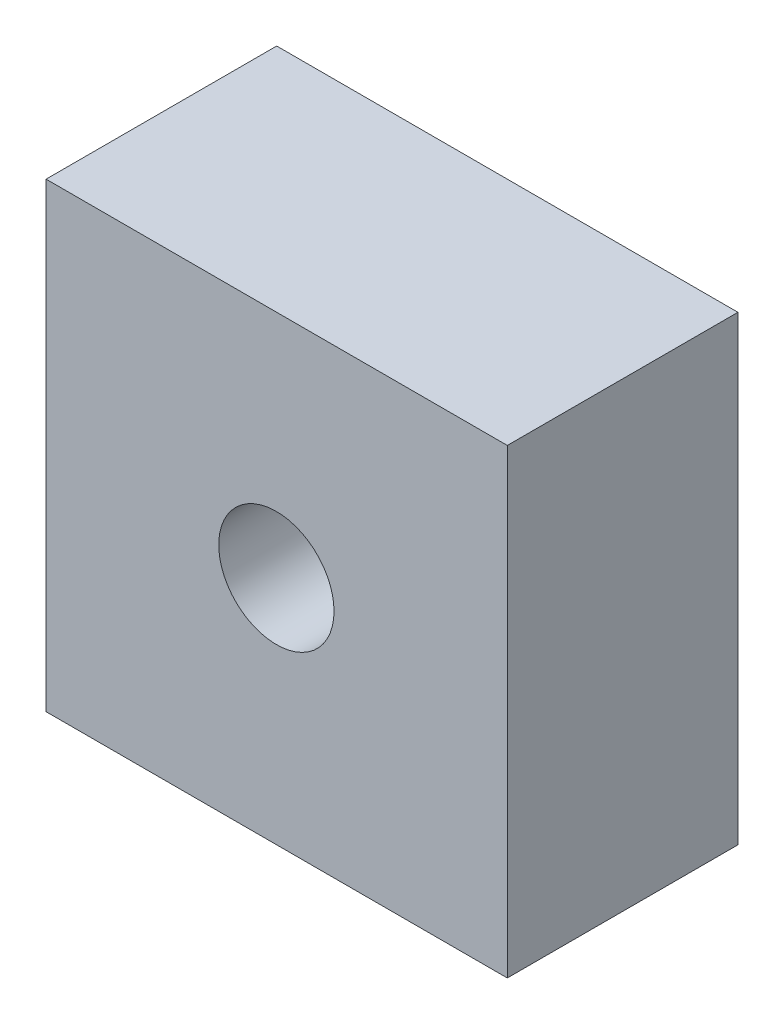
ISO-10303-21;
HEADER;
FILE_DESCRIPTION(('STEP AP214'),'2;1');
FILE_NAME('part.step','',(''),(''),'','','');
FILE_SCHEMA(('AUTOMOTIVE_DESIGN { 1 0 10303 214 1 1 1 1 }'));
ENDSEC;
DATA;
#1=APPLICATION_CONTEXT('core data for automotive mechanical design processes');
#2=APPLICATION_PROTOCOL_DEFINITION('international standard','automotive_design',2000,#1);
#3=PRODUCT_CONTEXT('',#1,'mechanical');
#4=PRODUCT('Part','Part','',(#3));
#5=PRODUCT_RELATED_PRODUCT_CATEGORY('part','',(#4));
#6=PRODUCT_DEFINITION_FORMATION('','',#4);
#7=PRODUCT_DEFINITION_CONTEXT('part definition',#1,'design');
#8=PRODUCT_DEFINITION('design','',#6,#7);
#9=PRODUCT_DEFINITION_SHAPE('','',#8);
#10=(LENGTH_UNIT() NAMED_UNIT(*) SI_UNIT(.MILLI.,.METRE.));
#11=(NAMED_UNIT(*) PLANE_ANGLE_UNIT() SI_UNIT($,.RADIAN.));
#12=(NAMED_UNIT(*) SI_UNIT($,.STERADIAN.) SOLID_ANGLE_UNIT());
#13=UNCERTAINTY_MEASURE_WITH_UNIT(LENGTH_MEASURE(1.E-05),#10,'distance_accuracy_value','');
#14=(GEOMETRIC_REPRESENTATION_CONTEXT(3) GLOBAL_UNCERTAINTY_ASSIGNED_CONTEXT((#13)) GLOBAL_UNIT_ASSIGNED_CONTEXT((#10,
#11,#12)) REPRESENTATION_CONTEXT('',''));
#15=CARTESIAN_POINT('',(0.,0.,0.));
#16=DIRECTION('',(0.,0.,1.));
#17=DIRECTION('',(1.,0.,0.));
#18=AXIS2_PLACEMENT_3D('',#15,#16,#17);
#19=CARTESIAN_POINT('',(0.,0.,10.));
#20=DIRECTION('',(1.,0.,0.));
#21=DIRECTION('',(0.,0.,-1.));
#22=AXIS2_PLACEMENT_3D('',#19,#20,#21);
#23=PLANE('',#22);
#24=DIRECTION('',(0.,-1.,0.));
#25=VECTOR('',#24,1.);
#26=CARTESIAN_POINT('',(0.,0.,0.));
#27=LINE('',#26,#25);
#28=CARTESIAN_POINT('',(0.,20.,0.));
#29=VERTEX_POINT('',#28);
#30=CARTESIAN_POINT('',(0.,0.,0.));
#31=VERTEX_POINT('',#30);
#32=EDGE_CURVE('E106',#29,#31,#27,.T.);
#33=ORIENTED_EDGE('',*,*,#32,.T.);
#34=DIRECTION('',(0.,0.,-1.));
#35=VECTOR('',#34,1.);
#36=CARTESIAN_POINT('',(0.,0.,10.));
#37=LINE('',#36,#35);
#38=CARTESIAN_POINT('',(0.,0.,10.));
#39=VERTEX_POINT('',#38);
#40=EDGE_CURVE('E11',#39,#31,#37,.T.);
#41=ORIENTED_EDGE('',*,*,#40,.F.);
#42=DIRECTION('',(0.,-1.,0.));
#43=VECTOR('',#42,1.);
#44=CARTESIAN_POINT('',(0.,0.,10.));
#45=LINE('',#44,#43);
#46=CARTESIAN_POINT('',(0.,20.,10.));
#47=VERTEX_POINT('',#46);
#48=EDGE_CURVE('E94',#47,#39,#45,.T.);
#49=ORIENTED_EDGE('',*,*,#48,.F.);
#50=DIRECTION('',(0.,0.,-1.));
#51=VECTOR('',#50,1.);
#52=CARTESIAN_POINT('',(0.,20.,10.));
#53=LINE('',#52,#51);
#54=EDGE_CURVE('E105',#47,#29,#53,.T.);
#55=ORIENTED_EDGE('',*,*,#54,.T.);
#56=EDGE_LOOP('',(#33,#41,#49,#55));
#57=FACE_BOUND('',#56,.T.);
#58=ADVANCED_FACE('F43',(#57),#23,.F.);
#59=CARTESIAN_POINT('',(0.,0.,10.));
#60=DIRECTION('',(0.,1.,0.));
#61=DIRECTION('',(0.,0.,1.));
#62=AXIS2_PLACEMENT_3D('',#59,#60,#61);
#63=PLANE('',#62);
#64=DIRECTION('',(1.,0.,0.));
#65=VECTOR('',#64,1.);
#66=CARTESIAN_POINT('',(0.,0.,0.));
#67=LINE('',#66,#65);
#68=CARTESIAN_POINT('',(20.,0.,0.));
#69=VERTEX_POINT('',#68);
#70=EDGE_CURVE('E98',#31,#69,#67,.T.);
#71=ORIENTED_EDGE('',*,*,#70,.T.);
#72=DIRECTION('',(0.,0.,-1.));
#73=VECTOR('',#72,1.);
#74=CARTESIAN_POINT('',(20.,0.,10.));
#75=LINE('',#74,#73);
#76=CARTESIAN_POINT('',(20.,0.,10.));
#77=VERTEX_POINT('',#76);
#78=EDGE_CURVE('E51',#77,#69,#75,.T.);
#79=ORIENTED_EDGE('',*,*,#78,.F.);
#80=DIRECTION('',(1.,0.,0.));
#81=VECTOR('',#80,1.);
#82=CARTESIAN_POINT('',(0.,0.,10.));
#83=LINE('',#82,#81);
#84=EDGE_CURVE('E90',#39,#77,#83,.T.);
#85=ORIENTED_EDGE('',*,*,#84,.F.);
#86=ORIENTED_EDGE('',*,*,#40,.T.);
#87=EDGE_LOOP('',(#71,#79,#85,#86));
#88=FACE_BOUND('',#87,.T.);
#89=ADVANCED_FACE('F100',(#88),#63,.F.);
#90=CARTESIAN_POINT('',(20.,0.,10.));
#91=DIRECTION('',(-1.,0.,0.));
#92=DIRECTION('',(0.,0.,1.));
#93=AXIS2_PLACEMENT_3D('',#90,#91,#92);
#94=PLANE('',#93);
#95=DIRECTION('',(0.,1.,0.));
#96=VECTOR('',#95,1.);
#97=CARTESIAN_POINT('',(20.,0.,0.));
#98=LINE('',#97,#96);
#99=CARTESIAN_POINT('',(20.,20.,0.));
#100=VERTEX_POINT('',#99);
#101=EDGE_CURVE('E78',#69,#100,#98,.T.);
#102=ORIENTED_EDGE('',*,*,#101,.T.);
#103=DIRECTION('',(0.,0.,-1.));
#104=VECTOR('',#103,1.);
#105=CARTESIAN_POINT('',(20.,20.,10.));
#106=LINE('',#105,#104);
#107=CARTESIAN_POINT('',(20.,20.,10.));
#108=VERTEX_POINT('',#107);
#109=EDGE_CURVE('E97',#108,#100,#106,.T.);
#110=ORIENTED_EDGE('',*,*,#109,.F.);
#111=DIRECTION('',(0.,1.,0.));
#112=VECTOR('',#111,1.);
#113=CARTESIAN_POINT('',(20.,0.,10.));
#114=LINE('',#113,#112);
#115=EDGE_CURVE('E95',#77,#108,#114,.T.);
#116=ORIENTED_EDGE('',*,*,#115,.F.);
#117=ORIENTED_EDGE('',*,*,#78,.T.);
#118=EDGE_LOOP('',(#102,#110,#116,#117));
#119=FACE_BOUND('',#118,.T.);
#120=ADVANCED_FACE('F99',(#119),#94,.F.);
#121=CARTESIAN_POINT('',(0.,20.,10.));
#122=DIRECTION('',(0.,-1.,0.));
#123=DIRECTION('',(0.,0.,-1.));
#124=AXIS2_PLACEMENT_3D('',#121,#122,#123);
#125=PLANE('',#124);
#126=DIRECTION('',(-1.,0.,0.));
#127=VECTOR('',#126,1.);
#128=CARTESIAN_POINT('',(0.,20.,0.));
#129=LINE('',#128,#127);
#130=EDGE_CURVE('E82',#100,#29,#129,.T.);
#131=ORIENTED_EDGE('',*,*,#130,.T.);
#132=ORIENTED_EDGE('',*,*,#54,.F.);
#133=DIRECTION('',(-1.,0.,0.));
#134=VECTOR('',#133,1.);
#135=CARTESIAN_POINT('',(0.,20.,10.));
#136=LINE('',#135,#134);
#137=EDGE_CURVE('E56',#108,#47,#136,.T.);
#138=ORIENTED_EDGE('',*,*,#137,.F.);
#139=ORIENTED_EDGE('',*,*,#109,.T.);
#140=EDGE_LOOP('',(#131,#132,#138,#139));
#141=FACE_BOUND('',#140,.T.);
#142=ADVANCED_FACE('F111',(#141),#125,.F.);
#143=CARTESIAN_POINT('',(0.,0.,10.));
#144=DIRECTION('',(0.,0.,-1.));
#145=DIRECTION('',(-1.,0.,0.));
#146=AXIS2_PLACEMENT_3D('',#143,#144,#145);
#147=PLANE('',#146);
#148=CARTESIAN_POINT('',(9.98648737498797,10.0143055988724,10.));
#149=DIRECTION('',(0.,0.,1.));
#150=DIRECTION('',(1.,0.,0.));
#151=AXIS2_PLACEMENT_3D('',#148,#149,#150);
#152=CIRCLE('',#151,2.50000000000001);
#153=CARTESIAN_POINT('',(12.486487374988,10.0143055988724,10.));
#154=VERTEX_POINT('',#153);
#155=EDGE_CURVE('E122',#154,#154,#152,.T.);
#156=ORIENTED_EDGE('',*,*,#155,.F.);
#157=EDGE_LOOP('',(#156));
#158=FACE_BOUND('',#157,.T.);
#159=ORIENTED_EDGE('',*,*,#48,.T.);
#160=ORIENTED_EDGE('',*,*,#84,.T.);
#161=ORIENTED_EDGE('',*,*,#115,.T.);
#162=ORIENTED_EDGE('',*,*,#137,.T.);
#163=EDGE_LOOP('',(#159,#160,#161,#162));
#164=FACE_BOUND('',#163,.T.);
#165=ADVANCED_FACE('F89',(#158,#164),#147,.F.);
#166=CARTESIAN_POINT('',(0.,0.,0.));
#167=DIRECTION('',(0.,0.,-1.));
#168=DIRECTION('',(-1.,0.,0.));
#169=AXIS2_PLACEMENT_3D('',#166,#167,#168);
#170=PLANE('',#169);
#171=ORIENTED_EDGE('',*,*,#32,.F.);
#172=ORIENTED_EDGE('',*,*,#130,.F.);
#173=ORIENTED_EDGE('',*,*,#101,.F.);
#174=ORIENTED_EDGE('',*,*,#70,.F.);
#175=EDGE_LOOP('',(#171,#172,#173,#174));
#176=FACE_BOUND('',#175,.T.);
#177=ADVANCED_FACE('F119',(#176),#170,.T.);
#178=CARTESIAN_POINT('',(9.98648737498797,10.0143055988724,5.));
#179=DIRECTION('',(0.,0.,-1.));
#180=DIRECTION('',(-1.,0.,0.));
#181=AXIS2_PLACEMENT_3D('',#178,#179,#180);
#182=PLANE('',#181);
#183=CARTESIAN_POINT('',(9.98648737498797,10.0143055988724,5.));
#184=DIRECTION('',(0.,0.,1.));
#185=DIRECTION('',(1.,0.,0.));
#186=AXIS2_PLACEMENT_3D('',#183,#184,#185);
#187=CIRCLE('',#186,2.50000000000001);
#188=CARTESIAN_POINT('',(12.486487374988,10.0143055988724,5.));
#189=VERTEX_POINT('',#188);
#190=EDGE_CURVE('E108',#189,#189,#187,.T.);
#191=ORIENTED_EDGE('',*,*,#190,.T.);
#192=EDGE_LOOP('',(#191));
#193=FACE_BOUND('',#192,.T.);
#194=ADVANCED_FACE('F135',(#193),#182,.F.);
#195=CARTESIAN_POINT('',(9.98648737498797,10.0143055988724,10.));
#196=DIRECTION('',(0.,0.,1.));
#197=DIRECTION('',(1.,0.,0.));
#198=AXIS2_PLACEMENT_3D('',#195,#196,#197);
#199=CYLINDRICAL_SURFACE('',#198,2.50000000000001);
#200=ORIENTED_EDGE('',*,*,#190,.F.);
#201=EDGE_LOOP('',(#200));
#202=FACE_BOUND('',#201,.T.);
#203=ORIENTED_EDGE('',*,*,#155,.T.);
#204=EDGE_LOOP('',(#203));
#205=FACE_BOUND('',#204,.T.);
#206=ADVANCED_FACE('F127',(#202,#205),#199,.F.);
#207=CLOSED_SHELL('',(#58,#89,#120,#142,#165,#177,#194,#206));
#208=MANIFOLD_SOLID_BREP('B2',#207);
#209=ADVANCED_BREP_SHAPE_REPRESENTATION('',(#18,#208),#14);
#210=SHAPE_DEFINITION_REPRESENTATION(#9,#209);
ENDSEC;
END-ISO-10303-21;
